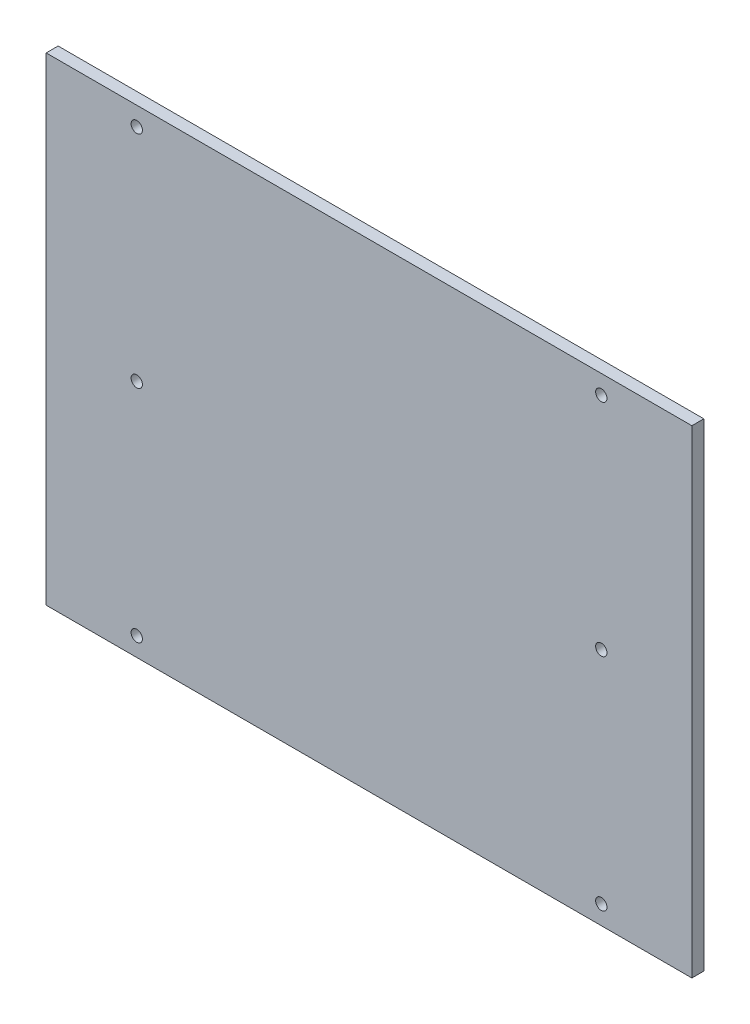
ISO-10303-21;
HEADER;
FILE_DESCRIPTION(('STEP AP214'),'2;1');
FILE_NAME('part.step','',(''),(''),'','','');
FILE_SCHEMA(('AUTOMOTIVE_DESIGN { 1 0 10303 214 1 1 1 1 }'));
ENDSEC;
DATA;
#1=APPLICATION_CONTEXT('core data for automotive mechanical design processes');
#2=APPLICATION_PROTOCOL_DEFINITION('international standard','automotive_design',2000,#1);
#3=PRODUCT_CONTEXT('',#1,'mechanical');
#4=PRODUCT('Part','Part','',(#3));
#5=PRODUCT_RELATED_PRODUCT_CATEGORY('part','',(#4));
#6=PRODUCT_DEFINITION_FORMATION('','',#4);
#7=PRODUCT_DEFINITION_CONTEXT('part definition',#1,'design');
#8=PRODUCT_DEFINITION('design','',#6,#7);
#9=PRODUCT_DEFINITION_SHAPE('','',#8);
#10=(LENGTH_UNIT() NAMED_UNIT(*) SI_UNIT(.MILLI.,.METRE.));
#11=(NAMED_UNIT(*) PLANE_ANGLE_UNIT() SI_UNIT($,.RADIAN.));
#12=(NAMED_UNIT(*) SI_UNIT($,.STERADIAN.) SOLID_ANGLE_UNIT());
#13=UNCERTAINTY_MEASURE_WITH_UNIT(LENGTH_MEASURE(1.E-05),#10,'distance_accuracy_value','');
#14=(GEOMETRIC_REPRESENTATION_CONTEXT(3) GLOBAL_UNCERTAINTY_ASSIGNED_CONTEXT((#13)) GLOBAL_UNIT_ASSIGNED_CONTEXT((#10,
#11,#12)) REPRESENTATION_CONTEXT('',''));
#15=CARTESIAN_POINT('',(0.,0.,0.));
#16=DIRECTION('',(0.,0.,1.));
#17=DIRECTION('',(1.,0.,0.));
#18=AXIS2_PLACEMENT_3D('',#15,#16,#17);
#19=CARTESIAN_POINT('',(0.,0.,3.175));
#20=DIRECTION('',(0.,0.,-1.));
#21=DIRECTION('',(-1.,0.,0.));
#22=AXIS2_PLACEMENT_3D('',#19,#20,#21);
#23=PLANE('',#22);
#24=DIRECTION('',(1.,0.,0.));
#25=VECTOR('',#24,1.);
#26=CARTESIAN_POINT('',(133.35,0.,3.175));
#27=LINE('',#26,#25);
#28=CARTESIAN_POINT('',(-19.05,0.,3.175));
#29=VERTEX_POINT('',#28);
#30=CARTESIAN_POINT('',(152.4,0.,3.175));
#31=VERTEX_POINT('',#30);
#32=EDGE_CURVE('E54',#29,#31,#27,.T.);
#33=ORIENTED_EDGE('',*,*,#32,.T.);
#34=DIRECTION('',(0.,1.,0.));
#35=VECTOR('',#34,1.);
#36=CARTESIAN_POINT('',(152.4,127.,3.175));
#37=LINE('',#36,#35);
#38=CARTESIAN_POINT('',(152.4,127.,3.175));
#39=VERTEX_POINT('',#38);
#40=EDGE_CURVE('E83',#31,#39,#37,.T.);
#41=ORIENTED_EDGE('',*,*,#40,.T.);
#42=DIRECTION('',(-1.,0.,0.));
#43=VECTOR('',#42,1.);
#44=CARTESIAN_POINT('',(0.,127.,3.175));
#45=LINE('',#44,#43);
#46=CARTESIAN_POINT('',(-19.05,127.,3.175));
#47=VERTEX_POINT('',#46);
#48=EDGE_CURVE('E11',#39,#47,#45,.T.);
#49=ORIENTED_EDGE('',*,*,#48,.T.);
#50=DIRECTION('',(0.,-1.,0.));
#51=VECTOR('',#50,1.);
#52=CARTESIAN_POINT('',(-19.05,127.,3.175));
#53=LINE('',#52,#51);
#54=EDGE_CURVE('E85',#47,#29,#53,.T.);
#55=ORIENTED_EDGE('',*,*,#54,.T.);
#56=EDGE_LOOP('',(#33,#41,#49,#55));
#57=FACE_BOUND('',#56,.T.);
#58=CARTESIAN_POINT('',(5.,4.99999999999999,3.175));
#59=DIRECTION('',(0.,0.,1.));
#60=DIRECTION('',(1.,0.,0.));
#61=AXIS2_PLACEMENT_3D('',#58,#59,#60);
#62=CIRCLE('',#61,1.5);
#63=CARTESIAN_POINT('',(6.5,4.99999999999999,3.175));
#64=VERTEX_POINT('',#63);
#65=EDGE_CURVE('E163',#64,#64,#62,.T.);
#66=ORIENTED_EDGE('',*,*,#65,.F.);
#67=EDGE_LOOP('',(#66));
#68=FACE_BOUND('',#67,.T.);
#69=CARTESIAN_POINT('',(5.,122.,3.175));
#70=DIRECTION('',(0.,0.,1.));
#71=DIRECTION('',(-1.,0.,0.));
#72=AXIS2_PLACEMENT_3D('',#69,#70,#71);
#73=CIRCLE('',#72,1.5);
#74=CARTESIAN_POINT('',(3.5,122.,3.175));
#75=VERTEX_POINT('',#74);
#76=EDGE_CURVE('E155',#75,#75,#73,.T.);
#77=ORIENTED_EDGE('',*,*,#76,.F.);
#78=EDGE_LOOP('',(#77));
#79=FACE_BOUND('',#78,.T.);
#80=CARTESIAN_POINT('',(5.,63.5,3.175));
#81=DIRECTION('',(0.,0.,1.));
#82=DIRECTION('',(1.,0.,0.));
#83=AXIS2_PLACEMENT_3D('',#80,#81,#82);
#84=CIRCLE('',#83,1.5);
#85=CARTESIAN_POINT('',(6.5,63.5,3.175));
#86=VERTEX_POINT('',#85);
#87=EDGE_CURVE('E147',#86,#86,#84,.T.);
#88=ORIENTED_EDGE('',*,*,#87,.F.);
#89=EDGE_LOOP('',(#88));
#90=FACE_BOUND('',#89,.T.);
#91=CARTESIAN_POINT('',(128.35,122.,3.175));
#92=DIRECTION('',(0.,0.,1.));
#93=DIRECTION('',(1.,0.,0.));
#94=AXIS2_PLACEMENT_3D('',#91,#92,#93);
#95=CIRCLE('',#94,1.5);
#96=CARTESIAN_POINT('',(129.85,122.,3.175));
#97=VERTEX_POINT('',#96);
#98=EDGE_CURVE('E139',#97,#97,#95,.T.);
#99=ORIENTED_EDGE('',*,*,#98,.F.);
#100=EDGE_LOOP('',(#99));
#101=FACE_BOUND('',#100,.T.);
#102=CARTESIAN_POINT('',(128.35,63.5,3.175));
#103=DIRECTION('',(0.,0.,1.));
#104=DIRECTION('',(-1.,0.,0.));
#105=AXIS2_PLACEMENT_3D('',#102,#103,#104);
#106=CIRCLE('',#105,1.5);
#107=CARTESIAN_POINT('',(126.85,63.5,3.175));
#108=VERTEX_POINT('',#107);
#109=EDGE_CURVE('E131',#108,#108,#106,.T.);
#110=ORIENTED_EDGE('',*,*,#109,.F.);
#111=EDGE_LOOP('',(#110));
#112=FACE_BOUND('',#111,.T.);
#113=CARTESIAN_POINT('',(128.35,4.99999999999999,3.175));
#114=DIRECTION('',(0.,0.,1.));
#115=DIRECTION('',(-1.,0.,0.));
#116=AXIS2_PLACEMENT_3D('',#113,#114,#115);
#117=CIRCLE('',#116,1.5);
#118=CARTESIAN_POINT('',(126.85,4.99999999999999,3.175));
#119=VERTEX_POINT('',#118);
#120=EDGE_CURVE('E123',#119,#119,#117,.T.);
#121=ORIENTED_EDGE('',*,*,#120,.F.);
#122=EDGE_LOOP('',(#121));
#123=FACE_BOUND('',#122,.T.);
#124=ADVANCED_FACE('F43',(#57,#68,#79,#90,#101,#112,#123),#23,.F.);
#125=CARTESIAN_POINT('',(0.,0.,0.));
#126=DIRECTION('',(0.,0.,-1.));
#127=DIRECTION('',(-1.,0.,0.));
#128=AXIS2_PLACEMENT_3D('',#125,#126,#127);
#129=PLANE('',#128);
#130=CARTESIAN_POINT('',(128.35,63.5,0.));
#131=DIRECTION('',(0.,0.,1.));
#132=DIRECTION('',(-1.,0.,0.));
#133=AXIS2_PLACEMENT_3D('',#130,#131,#132);
#134=CIRCLE('',#133,1.5);
#135=CARTESIAN_POINT('',(126.85,63.5,0.));
#136=VERTEX_POINT('',#135);
#137=EDGE_CURVE('E127',#136,#136,#134,.T.);
#138=ORIENTED_EDGE('',*,*,#137,.T.);
#139=EDGE_LOOP('',(#138));
#140=FACE_BOUND('',#139,.T.);
#141=CARTESIAN_POINT('',(5.,63.5,0.));
#142=DIRECTION('',(0.,0.,1.));
#143=DIRECTION('',(1.,0.,0.));
#144=AXIS2_PLACEMENT_3D('',#141,#142,#143);
#145=CIRCLE('',#144,1.5);
#146=CARTESIAN_POINT('',(6.5,63.5,0.));
#147=VERTEX_POINT('',#146);
#148=EDGE_CURVE('E143',#147,#147,#145,.T.);
#149=ORIENTED_EDGE('',*,*,#148,.T.);
#150=EDGE_LOOP('',(#149));
#151=FACE_BOUND('',#150,.T.);
#152=CARTESIAN_POINT('',(5.,4.99999999999999,0.));
#153=DIRECTION('',(0.,0.,1.));
#154=DIRECTION('',(1.,0.,0.));
#155=AXIS2_PLACEMENT_3D('',#152,#153,#154);
#156=CIRCLE('',#155,1.5);
#157=CARTESIAN_POINT('',(6.5,4.99999999999999,0.));
#158=VERTEX_POINT('',#157);
#159=EDGE_CURVE('E159',#158,#158,#156,.T.);
#160=ORIENTED_EDGE('',*,*,#159,.T.);
#161=EDGE_LOOP('',(#160));
#162=FACE_BOUND('',#161,.T.);
#163=DIRECTION('',(1.,0.,0.));
#164=VECTOR('',#163,1.);
#165=CARTESIAN_POINT('',(133.35,0.,0.));
#166=LINE('',#165,#164);
#167=CARTESIAN_POINT('',(-19.05,0.,0.));
#168=VERTEX_POINT('',#167);
#169=CARTESIAN_POINT('',(152.4,0.,0.));
#170=VERTEX_POINT('',#169);
#171=EDGE_CURVE('E91',#168,#170,#166,.T.);
#172=ORIENTED_EDGE('',*,*,#171,.F.);
#173=DIRECTION('',(0.,-1.,0.));
#174=VECTOR('',#173,1.);
#175=CARTESIAN_POINT('',(-19.05,127.,0.));
#176=LINE('',#175,#174);
#177=CARTESIAN_POINT('',(-19.05,127.,0.));
#178=VERTEX_POINT('',#177);
#179=EDGE_CURVE('E112',#178,#168,#176,.T.);
#180=ORIENTED_EDGE('',*,*,#179,.F.);
#181=DIRECTION('',(-1.,0.,0.));
#182=VECTOR('',#181,1.);
#183=CARTESIAN_POINT('',(0.,127.,0.));
#184=LINE('',#183,#182);
#185=CARTESIAN_POINT('',(152.4,127.,0.));
#186=VERTEX_POINT('',#185);
#187=EDGE_CURVE('E47',#186,#178,#184,.T.);
#188=ORIENTED_EDGE('',*,*,#187,.F.);
#189=DIRECTION('',(0.,1.,0.));
#190=VECTOR('',#189,1.);
#191=CARTESIAN_POINT('',(152.4,127.,0.));
#192=LINE('',#191,#190);
#193=EDGE_CURVE('E96',#170,#186,#192,.T.);
#194=ORIENTED_EDGE('',*,*,#193,.F.);
#195=EDGE_LOOP('',(#172,#180,#188,#194));
#196=FACE_BOUND('',#195,.T.);
#197=CARTESIAN_POINT('',(5.,122.,0.));
#198=DIRECTION('',(0.,0.,1.));
#199=DIRECTION('',(-1.,0.,0.));
#200=AXIS2_PLACEMENT_3D('',#197,#198,#199);
#201=CIRCLE('',#200,1.5);
#202=CARTESIAN_POINT('',(3.5,122.,0.));
#203=VERTEX_POINT('',#202);
#204=EDGE_CURVE('E151',#203,#203,#201,.T.);
#205=ORIENTED_EDGE('',*,*,#204,.T.);
#206=EDGE_LOOP('',(#205));
#207=FACE_BOUND('',#206,.T.);
#208=CARTESIAN_POINT('',(128.35,122.,0.));
#209=DIRECTION('',(0.,0.,1.));
#210=DIRECTION('',(1.,0.,0.));
#211=AXIS2_PLACEMENT_3D('',#208,#209,#210);
#212=CIRCLE('',#211,1.5);
#213=CARTESIAN_POINT('',(129.85,122.,0.));
#214=VERTEX_POINT('',#213);
#215=EDGE_CURVE('E135',#214,#214,#212,.T.);
#216=ORIENTED_EDGE('',*,*,#215,.T.);
#217=EDGE_LOOP('',(#216));
#218=FACE_BOUND('',#217,.T.);
#219=CARTESIAN_POINT('',(128.35,4.99999999999999,0.));
#220=DIRECTION('',(0.,0.,1.));
#221=DIRECTION('',(-1.,0.,0.));
#222=AXIS2_PLACEMENT_3D('',#219,#220,#221);
#223=CIRCLE('',#222,1.5);
#224=CARTESIAN_POINT('',(126.85,4.99999999999999,0.));
#225=VERTEX_POINT('',#224);
#226=EDGE_CURVE('E119',#225,#225,#223,.T.);
#227=ORIENTED_EDGE('',*,*,#226,.T.);
#228=EDGE_LOOP('',(#227));
#229=FACE_BOUND('',#228,.T.);
#230=ADVANCED_FACE('F176',(#140,#151,#162,#196,#207,#218,#229),#129,.T.);
#231=CARTESIAN_POINT('',(133.35,0.,3.175));
#232=DIRECTION('',(0.,1.,0.));
#233=DIRECTION('',(0.,0.,1.));
#234=AXIS2_PLACEMENT_3D('',#231,#232,#233);
#235=PLANE('',#234);
#236=ORIENTED_EDGE('',*,*,#171,.T.);
#237=DIRECTION('',(0.,0.,1.));
#238=VECTOR('',#237,1.);
#239=CARTESIAN_POINT('',(152.4,0.,-128.420802442595));
#240=LINE('',#239,#238);
#241=EDGE_CURVE('E89',#170,#31,#240,.T.);
#242=ORIENTED_EDGE('',*,*,#241,.T.);
#243=ORIENTED_EDGE('',*,*,#32,.F.);
#244=DIRECTION('',(0.,0.,1.));
#245=VECTOR('',#244,1.);
#246=CARTESIAN_POINT('',(-19.05,0.,-128.420802442595));
#247=LINE('',#246,#245);
#248=EDGE_CURVE('E116',#168,#29,#247,.T.);
#249=ORIENTED_EDGE('',*,*,#248,.F.);
#250=EDGE_LOOP('',(#236,#242,#243,#249));
#251=FACE_BOUND('',#250,.T.);
#252=ADVANCED_FACE('F45',(#251),#235,.F.);
#253=CARTESIAN_POINT('',(0.,127.,3.175));
#254=DIRECTION('',(0.,-1.,0.));
#255=DIRECTION('',(0.,0.,-1.));
#256=AXIS2_PLACEMENT_3D('',#253,#254,#255);
#257=PLANE('',#256);
#258=ORIENTED_EDGE('',*,*,#187,.T.);
#259=DIRECTION('',(0.,0.,1.));
#260=VECTOR('',#259,1.);
#261=CARTESIAN_POINT('',(-19.05,127.,-128.420802442595));
#262=LINE('',#261,#260);
#263=EDGE_CURVE('E111',#178,#47,#262,.T.);
#264=ORIENTED_EDGE('',*,*,#263,.T.);
#265=ORIENTED_EDGE('',*,*,#48,.F.);
#266=DIRECTION('',(0.,0.,1.));
#267=VECTOR('',#266,1.);
#268=CARTESIAN_POINT('',(152.4,127.,-128.420802442595));
#269=LINE('',#268,#267);
#270=EDGE_CURVE('E101',#186,#39,#269,.T.);
#271=ORIENTED_EDGE('',*,*,#270,.F.);
#272=EDGE_LOOP('',(#258,#264,#265,#271));
#273=FACE_BOUND('',#272,.T.);
#274=ADVANCED_FACE('F173',(#273),#257,.F.);
#275=CARTESIAN_POINT('',(5.,4.99999999999999,3.175));
#276=DIRECTION('',(0.,0.,-1.));
#277=DIRECTION('',(-1.,0.,0.));
#278=AXIS2_PLACEMENT_3D('',#275,#276,#277);
#279=CYLINDRICAL_SURFACE('',#278,1.5);
#280=ORIENTED_EDGE('',*,*,#65,.T.);
#281=EDGE_LOOP('',(#280));
#282=FACE_BOUND('',#281,.T.);
#283=ORIENTED_EDGE('',*,*,#159,.F.);
#284=EDGE_LOOP('',(#283));
#285=FACE_BOUND('',#284,.T.);
#286=ADVANCED_FACE('F199',(#282,#285),#279,.F.);
#287=CARTESIAN_POINT('',(5.,122.,3.175));
#288=DIRECTION('',(0.,0.,-1.));
#289=DIRECTION('',(-1.,0.,0.));
#290=AXIS2_PLACEMENT_3D('',#287,#288,#289);
#291=CYLINDRICAL_SURFACE('',#290,1.5);
#292=ORIENTED_EDGE('',*,*,#76,.T.);
#293=EDGE_LOOP('',(#292));
#294=FACE_BOUND('',#293,.T.);
#295=ORIENTED_EDGE('',*,*,#204,.F.);
#296=EDGE_LOOP('',(#295));
#297=FACE_BOUND('',#296,.T.);
#298=ADVANCED_FACE('F206',(#294,#297),#291,.F.);
#299=CARTESIAN_POINT('',(5.,63.5,3.175));
#300=DIRECTION('',(0.,0.,-1.));
#301=DIRECTION('',(-1.,0.,0.));
#302=AXIS2_PLACEMENT_3D('',#299,#300,#301);
#303=CYLINDRICAL_SURFACE('',#302,1.5);
#304=ORIENTED_EDGE('',*,*,#87,.T.);
#305=EDGE_LOOP('',(#304));
#306=FACE_BOUND('',#305,.T.);
#307=ORIENTED_EDGE('',*,*,#148,.F.);
#308=EDGE_LOOP('',(#307));
#309=FACE_BOUND('',#308,.T.);
#310=ADVANCED_FACE('F248',(#306,#309),#303,.F.);
#311=CARTESIAN_POINT('',(128.35,122.,3.175));
#312=DIRECTION('',(0.,0.,-1.));
#313=DIRECTION('',(-1.,0.,0.));
#314=AXIS2_PLACEMENT_3D('',#311,#312,#313);
#315=CYLINDRICAL_SURFACE('',#314,1.5);
#316=ORIENTED_EDGE('',*,*,#98,.T.);
#317=EDGE_LOOP('',(#316));
#318=FACE_BOUND('',#317,.T.);
#319=ORIENTED_EDGE('',*,*,#215,.F.);
#320=EDGE_LOOP('',(#319));
#321=FACE_BOUND('',#320,.T.);
#322=ADVANCED_FACE('F237',(#318,#321),#315,.F.);
#323=CARTESIAN_POINT('',(128.35,63.5,3.175));
#324=DIRECTION('',(0.,0.,-1.));
#325=DIRECTION('',(-1.,0.,0.));
#326=AXIS2_PLACEMENT_3D('',#323,#324,#325);
#327=CYLINDRICAL_SURFACE('',#326,1.5);
#328=ORIENTED_EDGE('',*,*,#109,.T.);
#329=EDGE_LOOP('',(#328));
#330=FACE_BOUND('',#329,.T.);
#331=ORIENTED_EDGE('',*,*,#137,.F.);
#332=EDGE_LOOP('',(#331));
#333=FACE_BOUND('',#332,.T.);
#334=ADVANCED_FACE('F188',(#330,#333),#327,.F.);
#335=CARTESIAN_POINT('',(128.35,4.99999999999999,3.175));
#336=DIRECTION('',(0.,0.,-1.));
#337=DIRECTION('',(-1.,0.,0.));
#338=AXIS2_PLACEMENT_3D('',#335,#336,#337);
#339=CYLINDRICAL_SURFACE('',#338,1.5);
#340=ORIENTED_EDGE('',*,*,#120,.T.);
#341=EDGE_LOOP('',(#340));
#342=FACE_BOUND('',#341,.T.);
#343=ORIENTED_EDGE('',*,*,#226,.F.);
#344=EDGE_LOOP('',(#343));
#345=FACE_BOUND('',#344,.T.);
#346=ADVANCED_FACE('F181',(#342,#345),#339,.F.);
#347=CARTESIAN_POINT('',(-19.05,127.,-128.420802442595));
#348=DIRECTION('',(-1.,0.,0.));
#349=DIRECTION('',(0.,-1.,0.));
#350=AXIS2_PLACEMENT_3D('',#347,#348,#349);
#351=PLANE('',#350);
#352=ORIENTED_EDGE('',*,*,#263,.F.);
#353=ORIENTED_EDGE('',*,*,#179,.T.);
#354=ORIENTED_EDGE('',*,*,#248,.T.);
#355=ORIENTED_EDGE('',*,*,#54,.F.);
#356=EDGE_LOOP('',(#352,#353,#354,#355));
#357=FACE_BOUND('',#356,.T.);
#358=ADVANCED_FACE('F179',(#357),#351,.T.);
#359=CARTESIAN_POINT('',(152.4,127.,-128.420802442595));
#360=DIRECTION('',(1.,0.,0.));
#361=DIRECTION('',(0.,1.,0.));
#362=AXIS2_PLACEMENT_3D('',#359,#360,#361);
#363=PLANE('',#362);
#364=ORIENTED_EDGE('',*,*,#241,.F.);
#365=ORIENTED_EDGE('',*,*,#193,.T.);
#366=ORIENTED_EDGE('',*,*,#270,.T.);
#367=ORIENTED_EDGE('',*,*,#40,.F.);
#368=EDGE_LOOP('',(#364,#365,#366,#367));
#369=FACE_BOUND('',#368,.T.);
#370=ADVANCED_FACE('F99',(#369),#363,.T.);
#371=CLOSED_SHELL('',(#124,#230,#252,#274,#286,#298,#310,#322,#334,#346,#358,#370));
#372=MANIFOLD_SOLID_BREP('B2',#371);
#373=ADVANCED_BREP_SHAPE_REPRESENTATION('',(#18,#372),#14);
#374=SHAPE_DEFINITION_REPRESENTATION(#9,#373);
ENDSEC;
END-ISO-10303-21;
